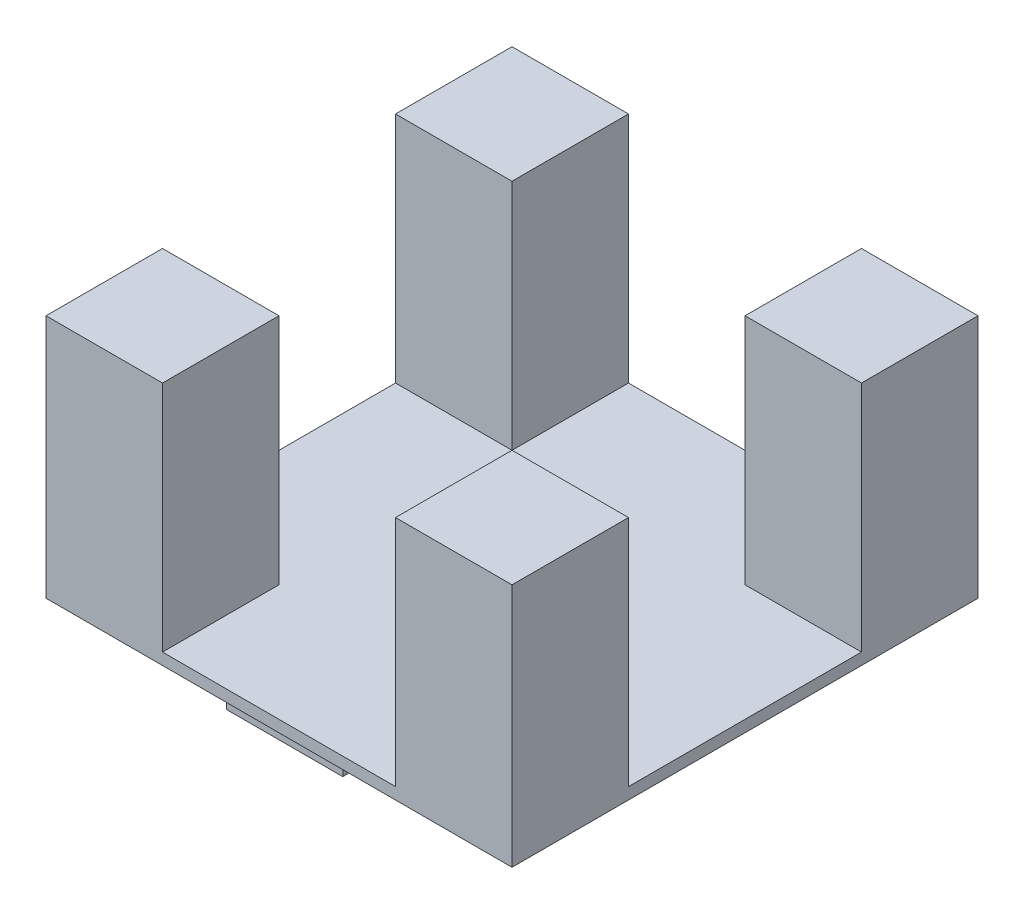
ISO-10303-21;
HEADER;
FILE_DESCRIPTION(('STEP AP214'),'2;1');
FILE_NAME('part.step','',(''),(''),'','','');
FILE_SCHEMA(('AUTOMOTIVE_DESIGN { 1 0 10303 214 1 1 1 1 }'));
ENDSEC;
DATA;
#1=APPLICATION_CONTEXT('core data for automotive mechanical design processes');
#2=APPLICATION_PROTOCOL_DEFINITION('international standard','automotive_design',2000,#1);
#3=PRODUCT_CONTEXT('',#1,'mechanical');
#4=PRODUCT('Part','Part','',(#3));
#5=PRODUCT_RELATED_PRODUCT_CATEGORY('part','',(#4));
#6=PRODUCT_DEFINITION_FORMATION('','',#4);
#7=PRODUCT_DEFINITION_CONTEXT('part definition',#1,'design');
#8=PRODUCT_DEFINITION('design','',#6,#7);
#9=PRODUCT_DEFINITION_SHAPE('','',#8);
#10=(LENGTH_UNIT() NAMED_UNIT(*) SI_UNIT(.MILLI.,.METRE.));
#11=(NAMED_UNIT(*) PLANE_ANGLE_UNIT() SI_UNIT($,.RADIAN.));
#12=(NAMED_UNIT(*) SI_UNIT($,.STERADIAN.) SOLID_ANGLE_UNIT());
#13=UNCERTAINTY_MEASURE_WITH_UNIT(LENGTH_MEASURE(1.E-05),#10,'distance_accuracy_value','');
#14=(GEOMETRIC_REPRESENTATION_CONTEXT(3) GLOBAL_UNCERTAINTY_ASSIGNED_CONTEXT((#13)) GLOBAL_UNIT_ASSIGNED_CONTEXT((#10,
#11,#12)) REPRESENTATION_CONTEXT('',''));
#15=CARTESIAN_POINT('',(0.,0.,0.));
#16=DIRECTION('',(0.,0.,1.));
#17=DIRECTION('',(1.,0.,0.));
#18=AXIS2_PLACEMENT_3D('',#15,#16,#17);
#19=CARTESIAN_POINT('',(0.,0.,0.));
#20=DIRECTION('',(0.,1.,0.));
#21=DIRECTION('',(0.,0.,1.));
#22=AXIS2_PLACEMENT_3D('',#19,#20,#21);
#23=PLANE('',#22);
#24=DIRECTION('',(0.,0.,-1.));
#25=VECTOR('',#24,1.);
#26=CARTESIAN_POINT('',(1000.,0.,-1000.));
#27=LINE('',#26,#25);
#28=CARTESIAN_POINT('',(1000.,0.,1000.));
#29=VERTEX_POINT('',#28);
#30=CARTESIAN_POINT('',(1000.,0.,-1000.));
#31=VERTEX_POINT('',#30);
#32=EDGE_CURVE('E306',#29,#31,#27,.T.);
#33=ORIENTED_EDGE('',*,*,#32,.F.);
#34=DIRECTION('',(1.,0.,0.));
#35=VECTOR('',#34,1.);
#36=CARTESIAN_POINT('',(-1000.,0.,1000.));
#37=LINE('',#36,#35);
#38=CARTESIAN_POINT('',(-1000.,0.,1000.));
#39=VERTEX_POINT('',#38);
#40=EDGE_CURVE('E315',#39,#29,#37,.T.);
#41=ORIENTED_EDGE('',*,*,#40,.F.);
#42=DIRECTION('',(0.,0.,1.));
#43=VECTOR('',#42,1.);
#44=CARTESIAN_POINT('',(-1000.,0.,-1000.));
#45=LINE('',#44,#43);
#46=CARTESIAN_POINT('',(-1000.,0.,-1000.));
#47=VERTEX_POINT('',#46);
#48=EDGE_CURVE('E322',#47,#39,#45,.T.);
#49=ORIENTED_EDGE('',*,*,#48,.F.);
#50=DIRECTION('',(-1.,0.,0.));
#51=VECTOR('',#50,1.);
#52=CARTESIAN_POINT('',(-1000.,0.,-1000.));
#53=LINE('',#52,#51);
#54=EDGE_CURVE('E325',#31,#47,#53,.T.);
#55=ORIENTED_EDGE('',*,*,#54,.F.);
#56=EDGE_LOOP('',(#33,#41,#49,#55));
#57=FACE_BOUND('',#56,.T.);
#58=DIRECTION('',(0.,0.,1.));
#59=VECTOR('',#58,1.);
#60=CARTESIAN_POINT('',(250.,0.,976.243185446225));
#61=LINE('',#60,#59);
#62=CARTESIAN_POINT('',(250.,0.,476.243185446225));
#63=VERTEX_POINT('',#62);
#64=CARTESIAN_POINT('',(250.,0.,976.243185446225));
#65=VERTEX_POINT('',#64);
#66=EDGE_CURVE('E65',#63,#65,#61,.T.);
#67=ORIENTED_EDGE('',*,*,#66,.F.);
#68=DIRECTION('',(1.,0.,0.));
#69=VECTOR('',#68,1.);
#70=CARTESIAN_POINT('',(-250.,0.,476.243185446225));
#71=LINE('',#70,#69);
#72=CARTESIAN_POINT('',(-250.,0.,476.243185446225));
#73=VERTEX_POINT('',#72);
#74=EDGE_CURVE('E66',#73,#63,#71,.T.);
#75=ORIENTED_EDGE('',*,*,#74,.F.);
#76=DIRECTION('',(0.,0.,-1.));
#77=VECTOR('',#76,1.);
#78=CARTESIAN_POINT('',(-250.,0.,976.243185446225));
#79=LINE('',#78,#77);
#80=CARTESIAN_POINT('',(-250.,0.,976.243185446225));
#81=VERTEX_POINT('',#80);
#82=EDGE_CURVE('E597',#81,#73,#79,.T.);
#83=ORIENTED_EDGE('',*,*,#82,.F.);
#84=DIRECTION('',(-1.,0.,0.));
#85=VECTOR('',#84,1.);
#86=CARTESIAN_POINT('',(-250.,0.,976.243185446225));
#87=LINE('',#86,#85);
#88=EDGE_CURVE('E604',#65,#81,#87,.T.);
#89=ORIENTED_EDGE('',*,*,#88,.F.);
#90=EDGE_LOOP('',(#67,#75,#83,#89));
#91=FACE_BOUND('',#90,.T.);
#92=ADVANCED_FACE('F50',(#57,#91),#23,.F.);
#93=CARTESIAN_POINT('',(0.,50.,0.));
#94=DIRECTION('',(0.,1.,0.));
#95=DIRECTION('',(0.,0.,1.));
#96=AXIS2_PLACEMENT_3D('',#93,#94,#95);
#97=PLANE('',#96);
#98=DIRECTION('',(0.,0.,1.));
#99=VECTOR('',#98,1.);
#100=CARTESIAN_POINT('',(500.,50.,1000.));
#101=LINE('',#100,#99);
#102=CARTESIAN_POINT('',(500.,50.,500.));
#103=VERTEX_POINT('',#102);
#104=CARTESIAN_POINT('',(500.,50.,1000.));
#105=VERTEX_POINT('',#104);
#106=EDGE_CURVE('E210',#103,#105,#101,.T.);
#107=ORIENTED_EDGE('',*,*,#106,.F.);
#108=DIRECTION('',(-1.,0.,0.));
#109=VECTOR('',#108,1.);
#110=CARTESIAN_POINT('',(1000.,50.,500.));
#111=LINE('',#110,#109);
#112=CARTESIAN_POINT('',(1000.,50.,500.));
#113=VERTEX_POINT('',#112);
#114=EDGE_CURVE('E204',#113,#103,#111,.T.);
#115=ORIENTED_EDGE('',*,*,#114,.F.);
#116=DIRECTION('',(0.,0.,-1.));
#117=VECTOR('',#116,1.);
#118=CARTESIAN_POINT('',(1000.,50.,-1000.));
#119=LINE('',#118,#117);
#120=CARTESIAN_POINT('',(1000.,50.,-500.));
#121=VERTEX_POINT('',#120);
#122=EDGE_CURVE('E310',#113,#121,#119,.T.);
#123=ORIENTED_EDGE('',*,*,#122,.T.);
#124=DIRECTION('',(-1.,0.,0.));
#125=VECTOR('',#124,1.);
#126=CARTESIAN_POINT('',(1000.,50.,-500.));
#127=LINE('',#126,#125);
#128=CARTESIAN_POINT('',(500.,50.,-500.));
#129=VERTEX_POINT('',#128);
#130=EDGE_CURVE('E239',#121,#129,#127,.T.);
#131=ORIENTED_EDGE('',*,*,#130,.T.);
#132=DIRECTION('',(0.,0.,-1.));
#133=VECTOR('',#132,1.);
#134=CARTESIAN_POINT('',(500.,50.,-1000.));
#135=LINE('',#134,#133);
#136=CARTESIAN_POINT('',(500.,50.,-1000.));
#137=VERTEX_POINT('',#136);
#138=EDGE_CURVE('E233',#129,#137,#135,.T.);
#139=ORIENTED_EDGE('',*,*,#138,.T.);
#140=DIRECTION('',(-1.,0.,0.));
#141=VECTOR('',#140,1.);
#142=CARTESIAN_POINT('',(-1000.,50.,-1000.));
#143=LINE('',#142,#141);
#144=CARTESIAN_POINT('',(-500.,50.,-1000.));
#145=VERTEX_POINT('',#144);
#146=EDGE_CURVE('E313',#137,#145,#143,.T.);
#147=ORIENTED_EDGE('',*,*,#146,.T.);
#148=DIRECTION('',(0.,0.,-1.));
#149=VECTOR('',#148,1.);
#150=CARTESIAN_POINT('',(-500.,50.,-1000.));
#151=LINE('',#150,#149);
#152=CARTESIAN_POINT('',(-500.,50.,-500.));
#153=VERTEX_POINT('',#152);
#154=EDGE_CURVE('E287',#153,#145,#151,.T.);
#155=ORIENTED_EDGE('',*,*,#154,.F.);
#156=DIRECTION('',(1.,0.,0.));
#157=VECTOR('',#156,1.);
#158=CARTESIAN_POINT('',(-1000.,50.,-500.));
#159=LINE('',#158,#157);
#160=CARTESIAN_POINT('',(-1000.,50.,-500.));
#161=VERTEX_POINT('',#160);
#162=EDGE_CURVE('E281',#161,#153,#159,.T.);
#163=ORIENTED_EDGE('',*,*,#162,.F.);
#164=DIRECTION('',(0.,0.,1.));
#165=VECTOR('',#164,1.);
#166=CARTESIAN_POINT('',(-1000.,50.,-1000.));
#167=LINE('',#166,#165);
#168=CARTESIAN_POINT('',(-1000.,50.,500.));
#169=VERTEX_POINT('',#168);
#170=EDGE_CURVE('E314',#161,#169,#167,.T.);
#171=ORIENTED_EDGE('',*,*,#170,.T.);
#172=DIRECTION('',(1.,0.,0.));
#173=VECTOR('',#172,1.);
#174=CARTESIAN_POINT('',(-1000.,50.,500.));
#175=LINE('',#174,#173);
#176=CARTESIAN_POINT('',(-500.,50.,500.));
#177=VERTEX_POINT('',#176);
#178=EDGE_CURVE('E262',#169,#177,#175,.T.);
#179=ORIENTED_EDGE('',*,*,#178,.T.);
#180=DIRECTION('',(0.,0.,1.));
#181=VECTOR('',#180,1.);
#182=CARTESIAN_POINT('',(-500.,50.,1000.));
#183=LINE('',#182,#181);
#184=CARTESIAN_POINT('',(-500.,50.,1000.));
#185=VERTEX_POINT('',#184);
#186=EDGE_CURVE('E259',#177,#185,#183,.T.);
#187=ORIENTED_EDGE('',*,*,#186,.T.);
#188=DIRECTION('',(1.,0.,0.));
#189=VECTOR('',#188,1.);
#190=CARTESIAN_POINT('',(-1000.,50.,1000.));
#191=LINE('',#190,#189);
#192=EDGE_CURVE('E320',#185,#105,#191,.T.);
#193=ORIENTED_EDGE('',*,*,#192,.T.);
#194=EDGE_LOOP('',(#107,#115,#123,#131,#139,#147,#155,#163,#171,#179,#187,#193));
#195=FACE_BOUND('',#194,.T.);
#196=ADVANCED_FACE('F357',(#195),#97,.T.);
#197=CARTESIAN_POINT('',(1000.,50.,-1000.));
#198=DIRECTION('',(-1.,0.,0.));
#199=DIRECTION('',(0.,0.,1.));
#200=AXIS2_PLACEMENT_3D('',#197,#198,#199);
#201=PLANE('',#200);
#202=ORIENTED_EDGE('',*,*,#32,.T.);
#203=DIRECTION('',(0.,-1.,0.));
#204=VECTOR('',#203,1.);
#205=CARTESIAN_POINT('',(1000.,50.,-1000.));
#206=LINE('',#205,#204);
#207=CARTESIAN_POINT('',(1000.,1050.,-1000.));
#208=VERTEX_POINT('',#207);
#209=EDGE_CURVE('E11',#208,#31,#206,.T.);
#210=ORIENTED_EDGE('',*,*,#209,.F.);
#211=DIRECTION('',(0.,0.,1.));
#212=VECTOR('',#211,1.);
#213=CARTESIAN_POINT('',(1000.,1050.,-1000.));
#214=LINE('',#213,#212);
#215=CARTESIAN_POINT('',(1000.,1050.,-500.));
#216=VERTEX_POINT('',#215);
#217=EDGE_CURVE('E234',#208,#216,#214,.T.);
#218=ORIENTED_EDGE('',*,*,#217,.T.);
#219=DIRECTION('',(0.,-1.,0.));
#220=VECTOR('',#219,1.);
#221=CARTESIAN_POINT('',(1000.,1050.,-500.));
#222=LINE('',#221,#220);
#223=EDGE_CURVE('E247',#216,#121,#222,.T.);
#224=ORIENTED_EDGE('',*,*,#223,.T.);
#225=ORIENTED_EDGE('',*,*,#122,.F.);
#226=DIRECTION('',(0.,-1.,0.));
#227=VECTOR('',#226,1.);
#228=CARTESIAN_POINT('',(1000.,1050.,500.));
#229=LINE('',#228,#227);
#230=CARTESIAN_POINT('',(1000.,1050.,500.));
#231=VERTEX_POINT('',#230);
#232=EDGE_CURVE('E231',#231,#113,#229,.T.);
#233=ORIENTED_EDGE('',*,*,#232,.F.);
#234=DIRECTION('',(0.,0.,-1.));
#235=VECTOR('',#234,1.);
#236=CARTESIAN_POINT('',(1000.,1050.,1000.));
#237=LINE('',#236,#235);
#238=CARTESIAN_POINT('',(1000.,1050.,1000.));
#239=VERTEX_POINT('',#238);
#240=EDGE_CURVE('E213',#239,#231,#237,.T.);
#241=ORIENTED_EDGE('',*,*,#240,.F.);
#242=DIRECTION('',(0.,-1.,0.));
#243=VECTOR('',#242,1.);
#244=CARTESIAN_POINT('',(1000.,50.,1000.));
#245=LINE('',#244,#243);
#246=EDGE_CURVE('E317',#239,#29,#245,.T.);
#247=ORIENTED_EDGE('',*,*,#246,.T.);
#248=EDGE_LOOP('',(#202,#210,#218,#224,#225,#233,#241,#247));
#249=FACE_BOUND('',#248,.T.);
#250=ADVANCED_FACE('F47',(#249),#201,.F.);
#251=CARTESIAN_POINT('',(-1000.,50.,-1000.));
#252=DIRECTION('',(0.,0.,1.));
#253=DIRECTION('',(1.,0.,0.));
#254=AXIS2_PLACEMENT_3D('',#251,#252,#253);
#255=PLANE('',#254);
#256=ORIENTED_EDGE('',*,*,#54,.T.);
#257=DIRECTION('',(0.,-1.,0.));
#258=VECTOR('',#257,1.);
#259=CARTESIAN_POINT('',(-1000.,50.,-1000.));
#260=LINE('',#259,#258);
#261=CARTESIAN_POINT('',(-1000.,1050.,-1000.));
#262=VERTEX_POINT('',#261);
#263=EDGE_CURVE('E54',#262,#47,#260,.T.);
#264=ORIENTED_EDGE('',*,*,#263,.F.);
#265=DIRECTION('',(-1.,0.,0.));
#266=VECTOR('',#265,1.);
#267=CARTESIAN_POINT('',(-1000.,1050.,-1000.));
#268=LINE('',#267,#266);
#269=CARTESIAN_POINT('',(-500.,1050.,-1000.));
#270=VERTEX_POINT('',#269);
#271=EDGE_CURVE('E295',#270,#262,#268,.T.);
#272=ORIENTED_EDGE('',*,*,#271,.F.);
#273=DIRECTION('',(0.,-1.,0.));
#274=VECTOR('',#273,1.);
#275=CARTESIAN_POINT('',(-500.,1050.,-1000.));
#276=LINE('',#275,#274);
#277=EDGE_CURVE('E293',#270,#145,#276,.T.);
#278=ORIENTED_EDGE('',*,*,#277,.T.);
#279=ORIENTED_EDGE('',*,*,#146,.F.);
#280=DIRECTION('',(0.,-1.,0.));
#281=VECTOR('',#280,1.);
#282=CARTESIAN_POINT('',(500.,1050.,-1000.));
#283=LINE('',#282,#281);
#284=CARTESIAN_POINT('',(500.,1050.,-1000.));
#285=VERTEX_POINT('',#284);
#286=EDGE_CURVE('E260',#285,#137,#283,.T.);
#287=ORIENTED_EDGE('',*,*,#286,.F.);
#288=DIRECTION('',(1.,0.,0.));
#289=VECTOR('',#288,1.);
#290=CARTESIAN_POINT('',(1000.,1050.,-1000.));
#291=LINE('',#290,#289);
#292=EDGE_CURVE('E236',#285,#208,#291,.T.);
#293=ORIENTED_EDGE('',*,*,#292,.T.);
#294=ORIENTED_EDGE('',*,*,#209,.T.);
#295=EDGE_LOOP('',(#256,#264,#272,#278,#279,#287,#293,#294));
#296=FACE_BOUND('',#295,.T.);
#297=ADVANCED_FACE('F383',(#296),#255,.F.);
#298=CARTESIAN_POINT('',(-1000.,50.,-1000.));
#299=DIRECTION('',(1.,0.,0.));
#300=DIRECTION('',(0.,0.,-1.));
#301=AXIS2_PLACEMENT_3D('',#298,#299,#300);
#302=PLANE('',#301);
#303=ORIENTED_EDGE('',*,*,#48,.T.);
#304=DIRECTION('',(0.,-1.,0.));
#305=VECTOR('',#304,1.);
#306=CARTESIAN_POINT('',(-1000.,50.,1000.));
#307=LINE('',#306,#305);
#308=CARTESIAN_POINT('',(-1000.,1050.,1000.));
#309=VERTEX_POINT('',#308);
#310=EDGE_CURVE('E329',#309,#39,#307,.T.);
#311=ORIENTED_EDGE('',*,*,#310,.F.);
#312=DIRECTION('',(0.,0.,-1.));
#313=VECTOR('',#312,1.);
#314=CARTESIAN_POINT('',(-1000.,1050.,1000.));
#315=LINE('',#314,#313);
#316=CARTESIAN_POINT('',(-1000.,1050.,500.));
#317=VERTEX_POINT('',#316);
#318=EDGE_CURVE('E257',#309,#317,#315,.T.);
#319=ORIENTED_EDGE('',*,*,#318,.T.);
#320=DIRECTION('',(0.,-1.,0.));
#321=VECTOR('',#320,1.);
#322=CARTESIAN_POINT('',(-1000.,1050.,500.));
#323=LINE('',#322,#321);
#324=EDGE_CURVE('E272',#317,#169,#323,.T.);
#325=ORIENTED_EDGE('',*,*,#324,.T.);
#326=ORIENTED_EDGE('',*,*,#170,.F.);
#327=DIRECTION('',(0.,-1.,0.));
#328=VECTOR('',#327,1.);
#329=CARTESIAN_POINT('',(-1000.,1050.,-500.));
#330=LINE('',#329,#328);
#331=CARTESIAN_POINT('',(-1000.,1050.,-500.));
#332=VERTEX_POINT('',#331);
#333=EDGE_CURVE('E304',#332,#161,#330,.T.);
#334=ORIENTED_EDGE('',*,*,#333,.F.);
#335=DIRECTION('',(0.,0.,1.));
#336=VECTOR('',#335,1.);
#337=CARTESIAN_POINT('',(-1000.,1050.,-1000.));
#338=LINE('',#337,#336);
#339=EDGE_CURVE('E282',#262,#332,#338,.T.);
#340=ORIENTED_EDGE('',*,*,#339,.F.);
#341=ORIENTED_EDGE('',*,*,#263,.T.);
#342=EDGE_LOOP('',(#303,#311,#319,#325,#326,#334,#340,#341));
#343=FACE_BOUND('',#342,.T.);
#344=ADVANCED_FACE('F333',(#343),#302,.F.);
#345=CARTESIAN_POINT('',(-1000.,50.,1000.));
#346=DIRECTION('',(0.,0.,-1.));
#347=DIRECTION('',(-1.,0.,0.));
#348=AXIS2_PLACEMENT_3D('',#345,#346,#347);
#349=PLANE('',#348);
#350=ORIENTED_EDGE('',*,*,#192,.F.);
#351=DIRECTION('',(0.,-1.,0.));
#352=VECTOR('',#351,1.);
#353=CARTESIAN_POINT('',(-500.,1050.,1000.));
#354=LINE('',#353,#352);
#355=CARTESIAN_POINT('',(-500.,1050.,1000.));
#356=VERTEX_POINT('',#355);
#357=EDGE_CURVE('E283',#356,#185,#354,.T.);
#358=ORIENTED_EDGE('',*,*,#357,.F.);
#359=DIRECTION('',(-1.,0.,0.));
#360=VECTOR('',#359,1.);
#361=CARTESIAN_POINT('',(-1000.,1050.,1000.));
#362=LINE('',#361,#360);
#363=EDGE_CURVE('E263',#356,#309,#362,.T.);
#364=ORIENTED_EDGE('',*,*,#363,.T.);
#365=ORIENTED_EDGE('',*,*,#310,.T.);
#366=ORIENTED_EDGE('',*,*,#40,.T.);
#367=ORIENTED_EDGE('',*,*,#246,.F.);
#368=DIRECTION('',(1.,0.,0.));
#369=VECTOR('',#368,1.);
#370=CARTESIAN_POINT('',(1000.,1050.,1000.));
#371=LINE('',#370,#369);
#372=CARTESIAN_POINT('',(500.,1050.,1000.));
#373=VERTEX_POINT('',#372);
#374=EDGE_CURVE('E219',#373,#239,#371,.T.);
#375=ORIENTED_EDGE('',*,*,#374,.F.);
#376=DIRECTION('',(0.,-1.,0.));
#377=VECTOR('',#376,1.);
#378=CARTESIAN_POINT('',(500.,1050.,1000.));
#379=LINE('',#378,#377);
#380=EDGE_CURVE('E225',#373,#105,#379,.T.);
#381=ORIENTED_EDGE('',*,*,#380,.T.);
#382=EDGE_LOOP('',(#350,#358,#364,#365,#366,#367,#375,#381));
#383=FACE_BOUND('',#382,.T.);
#384=ADVANCED_FACE('F343',(#383),#349,.F.);
#385=CARTESIAN_POINT('',(-1000.,1050.,-500.));
#386=DIRECTION('',(0.,0.,-1.));
#387=DIRECTION('',(-1.,0.,0.));
#388=AXIS2_PLACEMENT_3D('',#385,#386,#387);
#389=PLANE('',#388);
#390=ORIENTED_EDGE('',*,*,#162,.T.);
#391=DIRECTION('',(0.,-1.,0.));
#392=VECTOR('',#391,1.);
#393=CARTESIAN_POINT('',(-500.,1050.,-500.));
#394=LINE('',#393,#392);
#395=CARTESIAN_POINT('',(-500.,1050.,-500.));
#396=VERTEX_POINT('',#395);
#397=EDGE_CURVE('E305',#396,#153,#394,.T.);
#398=ORIENTED_EDGE('',*,*,#397,.F.);
#399=DIRECTION('',(1.,0.,0.));
#400=VECTOR('',#399,1.);
#401=CARTESIAN_POINT('',(-1000.,1050.,-500.));
#402=LINE('',#401,#400);
#403=EDGE_CURVE('E290',#332,#396,#402,.T.);
#404=ORIENTED_EDGE('',*,*,#403,.F.);
#405=ORIENTED_EDGE('',*,*,#333,.T.);
#406=EDGE_LOOP('',(#390,#398,#404,#405));
#407=FACE_BOUND('',#406,.T.);
#408=ADVANCED_FACE('F385',(#407),#389,.F.);
#409=CARTESIAN_POINT('',(-500.,1050.,-1000.));
#410=DIRECTION('',(-1.,0.,0.));
#411=DIRECTION('',(0.,0.,1.));
#412=AXIS2_PLACEMENT_3D('',#409,#410,#411);
#413=PLANE('',#412);
#414=ORIENTED_EDGE('',*,*,#154,.T.);
#415=ORIENTED_EDGE('',*,*,#277,.F.);
#416=DIRECTION('',(0.,0.,-1.));
#417=VECTOR('',#416,1.);
#418=CARTESIAN_POINT('',(-500.,1050.,-1000.));
#419=LINE('',#418,#417);
#420=EDGE_CURVE('E289',#396,#270,#419,.T.);
#421=ORIENTED_EDGE('',*,*,#420,.F.);
#422=ORIENTED_EDGE('',*,*,#397,.T.);
#423=EDGE_LOOP('',(#414,#415,#421,#422));
#424=FACE_BOUND('',#423,.T.);
#425=ADVANCED_FACE('F402',(#424),#413,.F.);
#426=CARTESIAN_POINT('',(0.,1050.,0.));
#427=DIRECTION('',(0.,1.,0.));
#428=DIRECTION('',(0.,0.,1.));
#429=AXIS2_PLACEMENT_3D('',#426,#427,#428);
#430=PLANE('',#429);
#431=ORIENTED_EDGE('',*,*,#339,.T.);
#432=ORIENTED_EDGE('',*,*,#403,.T.);
#433=ORIENTED_EDGE('',*,*,#420,.T.);
#434=ORIENTED_EDGE('',*,*,#271,.T.);
#435=EDGE_LOOP('',(#431,#432,#433,#434));
#436=FACE_BOUND('',#435,.T.);
#437=ADVANCED_FACE('F431',(#436),#430,.T.);
#438=CARTESIAN_POINT('',(-500.,1050.,1000.));
#439=DIRECTION('',(1.,0.,0.));
#440=DIRECTION('',(0.,0.,-1.));
#441=AXIS2_PLACEMENT_3D('',#438,#439,#440);
#442=PLANE('',#441);
#443=ORIENTED_EDGE('',*,*,#186,.F.);
#444=DIRECTION('',(0.,-1.,0.));
#445=VECTOR('',#444,1.);
#446=CARTESIAN_POINT('',(-500.,1050.,500.));
#447=LINE('',#446,#445);
#448=CARTESIAN_POINT('',(-500.,1050.,500.));
#449=VERTEX_POINT('',#448);
#450=EDGE_CURVE('E276',#449,#177,#447,.T.);
#451=ORIENTED_EDGE('',*,*,#450,.F.);
#452=DIRECTION('',(0.,0.,1.));
#453=VECTOR('',#452,1.);
#454=CARTESIAN_POINT('',(-500.,1050.,1000.));
#455=LINE('',#454,#453);
#456=EDGE_CURVE('E270',#449,#356,#455,.T.);
#457=ORIENTED_EDGE('',*,*,#456,.T.);
#458=ORIENTED_EDGE('',*,*,#357,.T.);
#459=EDGE_LOOP('',(#443,#451,#457,#458));
#460=FACE_BOUND('',#459,.T.);
#461=ADVANCED_FACE('F415',(#460),#442,.T.);
#462=CARTESIAN_POINT('',(-1000.,1050.,500.));
#463=DIRECTION('',(0.,0.,-1.));
#464=DIRECTION('',(-1.,0.,0.));
#465=AXIS2_PLACEMENT_3D('',#462,#463,#464);
#466=PLANE('',#465);
#467=ORIENTED_EDGE('',*,*,#178,.F.);
#468=ORIENTED_EDGE('',*,*,#324,.F.);
#469=DIRECTION('',(1.,0.,0.));
#470=VECTOR('',#469,1.);
#471=CARTESIAN_POINT('',(-1000.,1050.,500.));
#472=LINE('',#471,#470);
#473=EDGE_CURVE('E269',#317,#449,#472,.T.);
#474=ORIENTED_EDGE('',*,*,#473,.T.);
#475=ORIENTED_EDGE('',*,*,#450,.T.);
#476=EDGE_LOOP('',(#467,#468,#474,#475));
#477=FACE_BOUND('',#476,.T.);
#478=ADVANCED_FACE('F406',(#477),#466,.T.);
#479=CARTESIAN_POINT('',(0.,1050.,0.));
#480=DIRECTION('',(0.,1.,0.));
#481=DIRECTION('',(0.,0.,-1.));
#482=AXIS2_PLACEMENT_3D('',#479,#480,#481);
#483=PLANE('',#482);
#484=ORIENTED_EDGE('',*,*,#318,.F.);
#485=ORIENTED_EDGE('',*,*,#363,.F.);
#486=ORIENTED_EDGE('',*,*,#456,.F.);
#487=ORIENTED_EDGE('',*,*,#473,.F.);
#488=EDGE_LOOP('',(#484,#485,#486,#487));
#489=FACE_BOUND('',#488,.T.);
#490=ADVANCED_FACE('F418',(#489),#483,.T.);
#491=CARTESIAN_POINT('',(500.,1050.,-1000.));
#492=DIRECTION('',(-1.,0.,0.));
#493=DIRECTION('',(0.,0.,1.));
#494=AXIS2_PLACEMENT_3D('',#491,#492,#493);
#495=PLANE('',#494);
#496=ORIENTED_EDGE('',*,*,#138,.F.);
#497=DIRECTION('',(0.,-1.,0.));
#498=VECTOR('',#497,1.);
#499=CARTESIAN_POINT('',(500.,1050.,-500.));
#500=LINE('',#499,#498);
#501=CARTESIAN_POINT('',(500.,1050.,-500.));
#502=VERTEX_POINT('',#501);
#503=EDGE_CURVE('E254',#502,#129,#500,.T.);
#504=ORIENTED_EDGE('',*,*,#503,.F.);
#505=DIRECTION('',(0.,0.,-1.));
#506=VECTOR('',#505,1.);
#507=CARTESIAN_POINT('',(500.,1050.,-1000.));
#508=LINE('',#507,#506);
#509=EDGE_CURVE('E245',#502,#285,#508,.T.);
#510=ORIENTED_EDGE('',*,*,#509,.T.);
#511=ORIENTED_EDGE('',*,*,#286,.T.);
#512=EDGE_LOOP('',(#496,#504,#510,#511));
#513=FACE_BOUND('',#512,.T.);
#514=ADVANCED_FACE('F416',(#513),#495,.T.);
#515=CARTESIAN_POINT('',(1000.,1050.,-500.));
#516=DIRECTION('',(0.,0.,1.));
#517=DIRECTION('',(1.,0.,0.));
#518=AXIS2_PLACEMENT_3D('',#515,#516,#517);
#519=PLANE('',#518);
#520=ORIENTED_EDGE('',*,*,#130,.F.);
#521=ORIENTED_EDGE('',*,*,#223,.F.);
#522=DIRECTION('',(-1.,0.,0.));
#523=VECTOR('',#522,1.);
#524=CARTESIAN_POINT('',(1000.,1050.,-500.));
#525=LINE('',#524,#523);
#526=EDGE_CURVE('E244',#216,#502,#525,.T.);
#527=ORIENTED_EDGE('',*,*,#526,.T.);
#528=ORIENTED_EDGE('',*,*,#503,.T.);
#529=EDGE_LOOP('',(#520,#521,#527,#528));
#530=FACE_BOUND('',#529,.T.);
#531=ADVANCED_FACE('F369',(#530),#519,.T.);
#532=CARTESIAN_POINT('',(0.,1050.,0.));
#533=DIRECTION('',(0.,1.,0.));
#534=DIRECTION('',(0.,0.,1.));
#535=AXIS2_PLACEMENT_3D('',#532,#533,#534);
#536=PLANE('',#535);
#537=ORIENTED_EDGE('',*,*,#217,.F.);
#538=ORIENTED_EDGE('',*,*,#292,.F.);
#539=ORIENTED_EDGE('',*,*,#509,.F.);
#540=ORIENTED_EDGE('',*,*,#526,.F.);
#541=EDGE_LOOP('',(#537,#538,#539,#540));
#542=FACE_BOUND('',#541,.T.);
#543=ADVANCED_FACE('F362',(#542),#536,.T.);
#544=CARTESIAN_POINT('',(1000.,1050.,500.));
#545=DIRECTION('',(0.,0.,1.));
#546=DIRECTION('',(1.,0.,0.));
#547=AXIS2_PLACEMENT_3D('',#544,#545,#546);
#548=PLANE('',#547);
#549=ORIENTED_EDGE('',*,*,#114,.T.);
#550=DIRECTION('',(0.,-1.,0.));
#551=VECTOR('',#550,1.);
#552=CARTESIAN_POINT('',(500.,1050.,500.));
#553=LINE('',#552,#551);
#554=CARTESIAN_POINT('',(500.,1050.,500.));
#555=VERTEX_POINT('',#554);
#556=EDGE_CURVE('E226',#555,#103,#553,.T.);
#557=ORIENTED_EDGE('',*,*,#556,.F.);
#558=DIRECTION('',(-1.,0.,0.));
#559=VECTOR('',#558,1.);
#560=CARTESIAN_POINT('',(1000.,1050.,500.));
#561=LINE('',#560,#559);
#562=EDGE_CURVE('E216',#231,#555,#561,.T.);
#563=ORIENTED_EDGE('',*,*,#562,.F.);
#564=ORIENTED_EDGE('',*,*,#232,.T.);
#565=EDGE_LOOP('',(#549,#557,#563,#564));
#566=FACE_BOUND('',#565,.T.);
#567=ADVANCED_FACE('F359',(#566),#548,.F.);
#568=CARTESIAN_POINT('',(500.,1050.,1000.));
#569=DIRECTION('',(1.,0.,0.));
#570=DIRECTION('',(0.,0.,-1.));
#571=AXIS2_PLACEMENT_3D('',#568,#569,#570);
#572=PLANE('',#571);
#573=ORIENTED_EDGE('',*,*,#106,.T.);
#574=ORIENTED_EDGE('',*,*,#380,.F.);
#575=DIRECTION('',(0.,0.,1.));
#576=VECTOR('',#575,1.);
#577=CARTESIAN_POINT('',(500.,1050.,1000.));
#578=LINE('',#577,#576);
#579=EDGE_CURVE('E217',#555,#373,#578,.T.);
#580=ORIENTED_EDGE('',*,*,#579,.F.);
#581=ORIENTED_EDGE('',*,*,#556,.T.);
#582=EDGE_LOOP('',(#573,#574,#580,#581));
#583=FACE_BOUND('',#582,.T.);
#584=ADVANCED_FACE('F356',(#583),#572,.F.);
#585=CARTESIAN_POINT('',(0.,1050.,0.));
#586=DIRECTION('',(0.,1.,0.));
#587=DIRECTION('',(0.,0.,-1.));
#588=AXIS2_PLACEMENT_3D('',#585,#586,#587);
#589=PLANE('',#588);
#590=ORIENTED_EDGE('',*,*,#240,.T.);
#591=ORIENTED_EDGE('',*,*,#562,.T.);
#592=ORIENTED_EDGE('',*,*,#579,.T.);
#593=ORIENTED_EDGE('',*,*,#374,.T.);
#594=EDGE_LOOP('',(#590,#591,#592,#593));
#595=FACE_BOUND('',#594,.T.);
#596=ADVANCED_FACE('F353',(#595),#589,.T.);
#597=CARTESIAN_POINT('',(250.,-50.,976.243185446225));
#598=DIRECTION('',(-1.,0.,0.));
#599=DIRECTION('',(0.,0.,1.));
#600=AXIS2_PLACEMENT_3D('',#597,#598,#599);
#601=PLANE('',#600);
#602=ORIENTED_EDGE('',*,*,#66,.T.);
#603=DIRECTION('',(0.,1.,0.));
#604=VECTOR('',#603,1.);
#605=CARTESIAN_POINT('',(250.,-50.,976.243185446225));
#606=LINE('',#605,#604);
#607=CARTESIAN_POINT('',(250.,-50.,976.243185446225));
#608=VERTEX_POINT('',#607);
#609=EDGE_CURVE('E190',#608,#65,#606,.T.);
#610=ORIENTED_EDGE('',*,*,#609,.F.);
#611=DIRECTION('',(0.,0.,1.));
#612=VECTOR('',#611,1.);
#613=CARTESIAN_POINT('',(250.,-50.,976.243185446225));
#614=LINE('',#613,#612);
#615=CARTESIAN_POINT('',(250.,-50.,476.243185446225));
#616=VERTEX_POINT('',#615);
#617=EDGE_CURVE('E192',#616,#608,#614,.T.);
#618=ORIENTED_EDGE('',*,*,#617,.F.);
#619=DIRECTION('',(0.,1.,0.));
#620=VECTOR('',#619,1.);
#621=CARTESIAN_POINT('',(250.,-50.,476.243185446225));
#622=LINE('',#621,#620);
#623=EDGE_CURVE('E600',#616,#63,#622,.T.);
#624=ORIENTED_EDGE('',*,*,#623,.T.);
#625=EDGE_LOOP('',(#602,#610,#618,#624));
#626=FACE_BOUND('',#625,.T.);
#627=ADVANCED_FACE('F201',(#626),#601,.F.);
#628=CARTESIAN_POINT('',(-250.,-50.,976.243185446225));
#629=DIRECTION('',(0.,0.,-1.));
#630=DIRECTION('',(-1.,0.,0.));
#631=AXIS2_PLACEMENT_3D('',#628,#629,#630);
#632=PLANE('',#631);
#633=ORIENTED_EDGE('',*,*,#88,.T.);
#634=DIRECTION('',(0.,1.,0.));
#635=VECTOR('',#634,1.);
#636=CARTESIAN_POINT('',(-250.,-50.,976.243185446225));
#637=LINE('',#636,#635);
#638=CARTESIAN_POINT('',(-250.,-50.,976.243185446225));
#639=VERTEX_POINT('',#638);
#640=EDGE_CURVE('E187',#639,#81,#637,.T.);
#641=ORIENTED_EDGE('',*,*,#640,.F.);
#642=DIRECTION('',(-1.,0.,0.));
#643=VECTOR('',#642,1.);
#644=CARTESIAN_POINT('',(-250.,-50.,976.243185446225));
#645=LINE('',#644,#643);
#646=EDGE_CURVE('E185',#608,#639,#645,.T.);
#647=ORIENTED_EDGE('',*,*,#646,.F.);
#648=ORIENTED_EDGE('',*,*,#609,.T.);
#649=EDGE_LOOP('',(#633,#641,#647,#648));
#650=FACE_BOUND('',#649,.T.);
#651=ADVANCED_FACE('F183',(#650),#632,.F.);
#652=CARTESIAN_POINT('',(-250.,-50.,976.243185446225));
#653=DIRECTION('',(1.,0.,0.));
#654=DIRECTION('',(0.,0.,-1.));
#655=AXIS2_PLACEMENT_3D('',#652,#653,#654);
#656=PLANE('',#655);
#657=ORIENTED_EDGE('',*,*,#82,.T.);
#658=DIRECTION('',(0.,1.,0.));
#659=VECTOR('',#658,1.);
#660=CARTESIAN_POINT('',(-250.,-50.,476.243185446225));
#661=LINE('',#660,#659);
#662=CARTESIAN_POINT('',(-250.,-50.,476.243185446225));
#663=VERTEX_POINT('',#662);
#664=EDGE_CURVE('E207',#663,#73,#661,.T.);
#665=ORIENTED_EDGE('',*,*,#664,.F.);
#666=DIRECTION('',(0.,0.,-1.));
#667=VECTOR('',#666,1.);
#668=CARTESIAN_POINT('',(-250.,-50.,976.243185446225));
#669=LINE('',#668,#667);
#670=EDGE_CURVE('E195',#639,#663,#669,.T.);
#671=ORIENTED_EDGE('',*,*,#670,.F.);
#672=ORIENTED_EDGE('',*,*,#640,.T.);
#673=EDGE_LOOP('',(#657,#665,#671,#672));
#674=FACE_BOUND('',#673,.T.);
#675=ADVANCED_FACE('F567',(#674),#656,.F.);
#676=CARTESIAN_POINT('',(-250.,-50.,476.243185446225));
#677=DIRECTION('',(0.,0.,1.));
#678=DIRECTION('',(1.,0.,0.));
#679=AXIS2_PLACEMENT_3D('',#676,#677,#678);
#680=PLANE('',#679);
#681=ORIENTED_EDGE('',*,*,#74,.T.);
#682=ORIENTED_EDGE('',*,*,#623,.F.);
#683=DIRECTION('',(1.,0.,0.));
#684=VECTOR('',#683,1.);
#685=CARTESIAN_POINT('',(-250.,-50.,476.243185446225));
#686=LINE('',#685,#684);
#687=EDGE_CURVE('E196',#663,#616,#686,.T.);
#688=ORIENTED_EDGE('',*,*,#687,.F.);
#689=ORIENTED_EDGE('',*,*,#664,.T.);
#690=EDGE_LOOP('',(#681,#682,#688,#689));
#691=FACE_BOUND('',#690,.T.);
#692=ADVANCED_FACE('F574',(#691),#680,.F.);
#693=CARTESIAN_POINT('',(0.,-50.,0.));
#694=DIRECTION('',(0.,-1.,0.));
#695=DIRECTION('',(0.,0.,-1.));
#696=AXIS2_PLACEMENT_3D('',#693,#694,#695);
#697=PLANE('',#696);
#698=ORIENTED_EDGE('',*,*,#617,.T.);
#699=ORIENTED_EDGE('',*,*,#646,.T.);
#700=ORIENTED_EDGE('',*,*,#670,.T.);
#701=ORIENTED_EDGE('',*,*,#687,.T.);
#702=EDGE_LOOP('',(#698,#699,#700,#701));
#703=FACE_BOUND('',#702,.T.);
#704=ADVANCED_FACE('F198',(#703),#697,.T.);
#705=CLOSED_SHELL('',(#92,#196,#250,#297,#344,#384,#408,#425,#437,#461,#478,#490,#514,#531,#543,
#567,#584,#596,#627,#651,#675,#692,#704));
#706=MANIFOLD_SOLID_BREP('B2',#705);
#707=ADVANCED_BREP_SHAPE_REPRESENTATION('',(#18,#706),#14);
#708=SHAPE_DEFINITION_REPRESENTATION(#9,#707);
ENDSEC;
END-ISO-10303-21;
